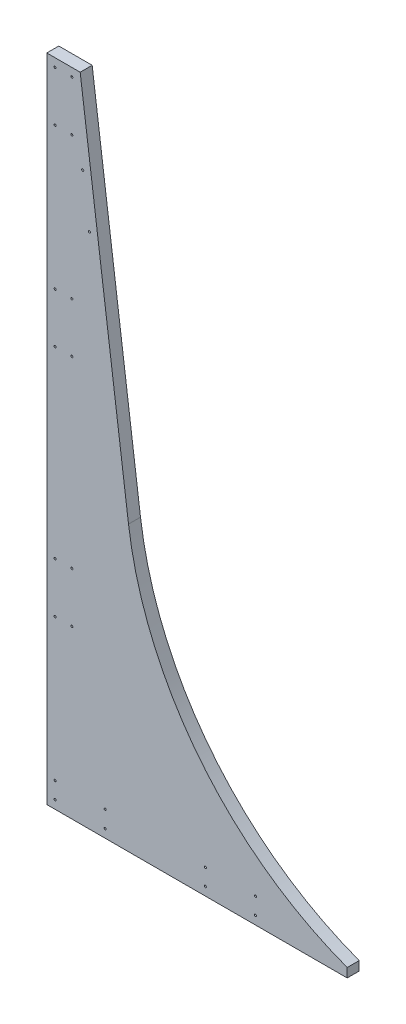
ISO-10303-21;
HEADER;
FILE_DESCRIPTION(('STEP AP214'),'2;1');
FILE_NAME('part.step','',(''),(''),'','','');
FILE_SCHEMA(('AUTOMOTIVE_DESIGN { 1 0 10303 214 1 1 1 1 }'));
ENDSEC;
DATA;
#1=APPLICATION_CONTEXT('core data for automotive mechanical design processes');
#2=APPLICATION_PROTOCOL_DEFINITION('international standard','automotive_design',2000,#1);
#3=PRODUCT_CONTEXT('',#1,'mechanical');
#4=PRODUCT('Part','Part','',(#3));
#5=PRODUCT_RELATED_PRODUCT_CATEGORY('part','',(#4));
#6=PRODUCT_DEFINITION_FORMATION('','',#4);
#7=PRODUCT_DEFINITION_CONTEXT('part definition',#1,'design');
#8=PRODUCT_DEFINITION('design','',#6,#7);
#9=PRODUCT_DEFINITION_SHAPE('','',#8);
#10=(LENGTH_UNIT() NAMED_UNIT(*) SI_UNIT(.MILLI.,.METRE.));
#11=(NAMED_UNIT(*) PLANE_ANGLE_UNIT() SI_UNIT($,.RADIAN.));
#12=(NAMED_UNIT(*) SI_UNIT($,.STERADIAN.) SOLID_ANGLE_UNIT());
#13=UNCERTAINTY_MEASURE_WITH_UNIT(LENGTH_MEASURE(1.E-05),#10,'distance_accuracy_value','');
#14=(GEOMETRIC_REPRESENTATION_CONTEXT(3) GLOBAL_UNCERTAINTY_ASSIGNED_CONTEXT((#13)) GLOBAL_UNIT_ASSIGNED_CONTEXT((#10,
#11,#12)) REPRESENTATION_CONTEXT('',''));
#15=CARTESIAN_POINT('',(0.,0.,0.));
#16=DIRECTION('',(0.,0.,1.));
#17=DIRECTION('',(1.,0.,0.));
#18=AXIS2_PLACEMENT_3D('',#15,#16,#17);
#19=CARTESIAN_POINT('',(638.116559349375,499.436357901165,18.25625));
#20=DIRECTION('',(0.,0.,-1.));
#21=DIRECTION('',(-1.,0.,0.));
#22=AXIS2_PLACEMENT_3D('',#19,#20,#21);
#23=CYLINDRICAL_SURFACE('',#22,518.182264806593);
#24=CARTESIAN_POINT('',(638.116559349375,499.436357901165,0.));
#25=DIRECTION('',(0.,0.,1.));
#26=DIRECTION('',(1.,0.,0.));
#27=AXIS2_PLACEMENT_3D('',#24,#25,#26);
#28=CIRCLE('',#27,518.182264806593);
#29=CARTESIAN_POINT('',(124.367415651835,431.8,0.));
#30=VERTEX_POINT('',#29);
#31=CARTESIAN_POINT('',(457.201,13.8620382080899,0.));
#32=VERTEX_POINT('',#31);
#33=EDGE_CURVE('E132',#30,#32,#28,.T.);
#34=ORIENTED_EDGE('',*,*,#33,.F.);
#35=DIRECTION('',(0.,0.,-1.));
#36=VECTOR('',#35,1.);
#37=CARTESIAN_POINT('',(124.367415651835,431.8,18.25625));
#38=LINE('',#37,#36);
#39=CARTESIAN_POINT('',(124.367415651835,431.8,18.25625));
#40=VERTEX_POINT('',#39);
#41=EDGE_CURVE('E11',#40,#30,#38,.T.);
#42=ORIENTED_EDGE('',*,*,#41,.F.);
#43=CARTESIAN_POINT('',(638.116559349375,499.436357901165,18.25625));
#44=DIRECTION('',(0.,0.,1.));
#45=DIRECTION('',(1.,0.,0.));
#46=AXIS2_PLACEMENT_3D('',#43,#44,#45);
#47=CIRCLE('',#46,518.182264806593);
#48=CARTESIAN_POINT('',(457.201,13.8620382080899,18.25625));
#49=VERTEX_POINT('',#48);
#50=EDGE_CURVE('E147',#40,#49,#47,.T.);
#51=ORIENTED_EDGE('',*,*,#50,.T.);
#52=DIRECTION('',(0.,0.,-1.));
#53=VECTOR('',#52,1.);
#54=CARTESIAN_POINT('',(457.201,13.8620382080899,18.25625));
#55=LINE('',#54,#53);
#56=EDGE_CURVE('E65',#49,#32,#55,.T.);
#57=ORIENTED_EDGE('',*,*,#56,.T.);
#58=EDGE_LOOP('',(#34,#42,#51,#57));
#59=FACE_BOUND('',#58,.T.);
#60=ADVANCED_FACE('F49',(#59),#23,.F.);
#61=CARTESIAN_POINT('',(178.127589027018,23.4509419846275,18.25625));
#62=DIRECTION('',(0.991444861373811,0.130526192220048,0.));
#63=DIRECTION('',(-0.130526192220048,0.991444861373811,0.));
#64=AXIS2_PLACEMENT_3D('',#61,#62,#63);
#65=PLANE('',#64);
#66=DIRECTION('',(0.130526192220048,-0.991444861373811,0.));
#67=VECTOR('',#66,1.);
#68=CARTESIAN_POINT('',(178.127589027018,23.4509419846275,0.));
#69=LINE('',#68,#67);
#70=CARTESIAN_POINT('',(50.8,990.6,0.));
#71=VERTEX_POINT('',#70);
#72=EDGE_CURVE('E134',#71,#30,#69,.T.);
#73=ORIENTED_EDGE('',*,*,#72,.F.);
#74=DIRECTION('',(0.,0.,-1.));
#75=VECTOR('',#74,1.);
#76=CARTESIAN_POINT('',(50.8,990.6,18.25625));
#77=LINE('',#76,#75);
#78=CARTESIAN_POINT('',(50.8,990.6,18.25625));
#79=VERTEX_POINT('',#78);
#80=EDGE_CURVE('E57',#79,#71,#77,.T.);
#81=ORIENTED_EDGE('',*,*,#80,.F.);
#82=DIRECTION('',(0.130526192220048,-0.991444861373811,0.));
#83=VECTOR('',#82,1.);
#84=CARTESIAN_POINT('',(178.127589027018,23.4509419846275,18.25625));
#85=LINE('',#84,#83);
#86=EDGE_CURVE('E127',#79,#40,#85,.T.);
#87=ORIENTED_EDGE('',*,*,#86,.T.);
#88=ORIENTED_EDGE('',*,*,#41,.T.);
#89=EDGE_LOOP('',(#73,#81,#87,#88));
#90=FACE_BOUND('',#89,.T.);
#91=ADVANCED_FACE('F156',(#90),#65,.T.);
#92=CARTESIAN_POINT('',(0.,990.6,18.25625));
#93=DIRECTION('',(0.,1.,0.));
#94=DIRECTION('',(0.,0.,1.));
#95=AXIS2_PLACEMENT_3D('',#92,#93,#94);
#96=PLANE('',#95);
#97=DIRECTION('',(1.,0.,0.));
#98=VECTOR('',#97,1.);
#99=CARTESIAN_POINT('',(0.,990.6,0.));
#100=LINE('',#99,#98);
#101=CARTESIAN_POINT('',(0.,990.6,0.));
#102=VERTEX_POINT('',#101);
#103=EDGE_CURVE('E138',#102,#71,#100,.T.);
#104=ORIENTED_EDGE('',*,*,#103,.F.);
#105=DIRECTION('',(0.,0.,-1.));
#106=VECTOR('',#105,1.);
#107=CARTESIAN_POINT('',(0.,990.6,18.25625));
#108=LINE('',#107,#106);
#109=CARTESIAN_POINT('',(0.,990.6,18.25625));
#110=VERTEX_POINT('',#109);
#111=EDGE_CURVE('E113',#110,#102,#108,.T.);
#112=ORIENTED_EDGE('',*,*,#111,.F.);
#113=DIRECTION('',(1.,0.,0.));
#114=VECTOR('',#113,1.);
#115=CARTESIAN_POINT('',(0.,990.6,18.25625));
#116=LINE('',#115,#114);
#117=EDGE_CURVE('E125',#110,#79,#116,.T.);
#118=ORIENTED_EDGE('',*,*,#117,.T.);
#119=ORIENTED_EDGE('',*,*,#80,.T.);
#120=EDGE_LOOP('',(#104,#112,#118,#119));
#121=FACE_BOUND('',#120,.T.);
#122=ADVANCED_FACE('F153',(#121),#96,.T.);
#123=CARTESIAN_POINT('',(0.,0.,18.25625));
#124=DIRECTION('',(-1.,0.,0.));
#125=DIRECTION('',(0.,0.,1.));
#126=AXIS2_PLACEMENT_3D('',#123,#124,#125);
#127=PLANE('',#126);
#128=DIRECTION('',(0.,1.,0.));
#129=VECTOR('',#128,1.);
#130=CARTESIAN_POINT('',(0.,0.,0.));
#131=LINE('',#130,#129);
#132=CARTESIAN_POINT('',(0.,0.,0.));
#133=VERTEX_POINT('',#132);
#134=EDGE_CURVE('E110',#133,#102,#131,.T.);
#135=ORIENTED_EDGE('',*,*,#134,.F.);
#136=DIRECTION('',(0.,0.,-1.));
#137=VECTOR('',#136,1.);
#138=CARTESIAN_POINT('',(0.,0.,18.25625));
#139=LINE('',#138,#137);
#140=CARTESIAN_POINT('',(0.,0.,18.25625));
#141=VERTEX_POINT('',#140);
#142=EDGE_CURVE('E104',#141,#133,#139,.T.);
#143=ORIENTED_EDGE('',*,*,#142,.F.);
#144=DIRECTION('',(0.,1.,0.));
#145=VECTOR('',#144,1.);
#146=CARTESIAN_POINT('',(0.,0.,18.25625));
#147=LINE('',#146,#145);
#148=EDGE_CURVE('E108',#141,#110,#147,.T.);
#149=ORIENTED_EDGE('',*,*,#148,.T.);
#150=ORIENTED_EDGE('',*,*,#111,.T.);
#151=EDGE_LOOP('',(#135,#143,#149,#150));
#152=FACE_BOUND('',#151,.T.);
#153=ADVANCED_FACE('F106',(#152),#127,.T.);
#154=CARTESIAN_POINT('',(0.,0.,18.25625));
#155=DIRECTION('',(0.,1.,0.));
#156=DIRECTION('',(0.,0.,1.));
#157=AXIS2_PLACEMENT_3D('',#154,#155,#156);
#158=PLANE('',#157);
#159=DIRECTION('',(1.,0.,0.));
#160=VECTOR('',#159,1.);
#161=CARTESIAN_POINT('',(0.,0.,0.));
#162=LINE('',#161,#160);
#163=CARTESIAN_POINT('',(457.201,0.,0.));
#164=VERTEX_POINT('',#163);
#165=EDGE_CURVE('E142',#133,#164,#162,.T.);
#166=ORIENTED_EDGE('',*,*,#165,.T.);
#167=DIRECTION('',(0.,0.,-1.));
#168=VECTOR('',#167,1.);
#169=CARTESIAN_POINT('',(457.201,0.,18.25625));
#170=LINE('',#169,#168);
#171=CARTESIAN_POINT('',(457.201,0.,18.25625));
#172=VERTEX_POINT('',#171);
#173=EDGE_CURVE('E85',#172,#164,#170,.T.);
#174=ORIENTED_EDGE('',*,*,#173,.F.);
#175=DIRECTION('',(1.,0.,0.));
#176=VECTOR('',#175,1.);
#177=CARTESIAN_POINT('',(0.,0.,18.25625));
#178=LINE('',#177,#176);
#179=EDGE_CURVE('E115',#141,#172,#178,.T.);
#180=ORIENTED_EDGE('',*,*,#179,.F.);
#181=ORIENTED_EDGE('',*,*,#142,.T.);
#182=EDGE_LOOP('',(#166,#174,#180,#181));
#183=FACE_BOUND('',#182,.T.);
#184=ADVANCED_FACE('F116',(#183),#158,.F.);
#185=CARTESIAN_POINT('',(457.201,0.,18.25625));
#186=DIRECTION('',(1.,0.,0.));
#187=DIRECTION('',(0.,0.,-1.));
#188=AXIS2_PLACEMENT_3D('',#185,#186,#187);
#189=PLANE('',#188);
#190=DIRECTION('',(0.,-1.,0.));
#191=VECTOR('',#190,1.);
#192=CARTESIAN_POINT('',(457.201,0.,0.));
#193=LINE('',#192,#191);
#194=EDGE_CURVE('E144',#32,#164,#193,.T.);
#195=ORIENTED_EDGE('',*,*,#194,.F.);
#196=ORIENTED_EDGE('',*,*,#56,.F.);
#197=DIRECTION('',(0.,-1.,0.));
#198=VECTOR('',#197,1.);
#199=CARTESIAN_POINT('',(457.201,0.,18.25625));
#200=LINE('',#199,#198);
#201=EDGE_CURVE('E119',#49,#172,#200,.T.);
#202=ORIENTED_EDGE('',*,*,#201,.T.);
#203=ORIENTED_EDGE('',*,*,#173,.T.);
#204=EDGE_LOOP('',(#195,#196,#202,#203));
#205=FACE_BOUND('',#204,.T.);
#206=ADVANCED_FACE('F159',(#205),#189,.T.);
#207=CARTESIAN_POINT('',(0.,0.,18.25625));
#208=DIRECTION('',(0.,0.,1.));
#209=DIRECTION('',(1.,0.,0.));
#210=AXIS2_PLACEMENT_3D('',#207,#208,#209);
#211=PLANE('',#210);
#212=CARTESIAN_POINT('',(64.7421997103902,787.4,18.25625));
#213=DIRECTION('',(0.,0.,1.));
#214=DIRECTION('',(1.,0.,0.));
#215=AXIS2_PLACEMENT_3D('',#212,#213,#214);
#216=CIRCLE('',#215,1.58750000000007);
#217=CARTESIAN_POINT('',(66.3296997103903,787.4,18.25625));
#218=VERTEX_POINT('',#217);
#219=EDGE_CURVE('E436',#218,#218,#216,.T.);
#220=ORIENTED_EDGE('',*,*,#219,.F.);
#221=EDGE_LOOP('',(#220));
#222=FACE_BOUND('',#221,.T.);
#223=CARTESIAN_POINT('',(54.7102793942309,863.6,18.25625));
#224=DIRECTION('',(0.,0.,1.));
#225=DIRECTION('',(1.,0.,0.));
#226=AXIS2_PLACEMENT_3D('',#223,#224,#225);
#227=CIRCLE('',#226,1.58750000000009);
#228=CARTESIAN_POINT('',(56.297779394231,863.6,18.25625));
#229=VERTEX_POINT('',#228);
#230=EDGE_CURVE('E442',#229,#229,#227,.T.);
#231=ORIENTED_EDGE('',*,*,#230,.F.);
#232=EDGE_LOOP('',(#231));
#233=FACE_BOUND('',#232,.T.);
#234=CARTESIAN_POINT('',(12.7000000000001,38.0999999999999,18.25625));
#235=DIRECTION('',(0.,0.,1.));
#236=DIRECTION('',(1.,0.,0.));
#237=AXIS2_PLACEMENT_3D('',#234,#235,#236);
#238=CIRCLE('',#237,1.5875);
#239=CARTESIAN_POINT('',(14.2875000000001,38.0999999999999,18.25625));
#240=VERTEX_POINT('',#239);
#241=EDGE_CURVE('E480',#240,#240,#238,.T.);
#242=ORIENTED_EDGE('',*,*,#241,.F.);
#243=EDGE_LOOP('',(#242));
#244=FACE_BOUND('',#243,.T.);
#245=CARTESIAN_POINT('',(38.1000000000001,330.2,18.25625));
#246=DIRECTION('',(0.,0.,1.));
#247=DIRECTION('',(1.,0.,0.));
#248=AXIS2_PLACEMENT_3D('',#245,#246,#247);
#249=CIRCLE('',#248,1.58750000000001);
#250=CARTESIAN_POINT('',(39.6875000000001,330.2,18.25625));
#251=VERTEX_POINT('',#250);
#252=EDGE_CURVE('E493',#251,#251,#249,.T.);
#253=ORIENTED_EDGE('',*,*,#252,.F.);
#254=EDGE_LOOP('',(#253));
#255=FACE_BOUND('',#254,.T.);
#256=CARTESIAN_POINT('',(12.7000000000001,330.2,18.25625));
#257=DIRECTION('',(0.,0.,1.));
#258=DIRECTION('',(1.,0.,0.));
#259=AXIS2_PLACEMENT_3D('',#256,#257,#258);
#260=CIRCLE('',#259,1.5875);
#261=CARTESIAN_POINT('',(14.2875000000001,330.2,18.25625));
#262=VERTEX_POINT('',#261);
#263=EDGE_CURVE('E492',#262,#262,#260,.T.);
#264=ORIENTED_EDGE('',*,*,#263,.F.);
#265=EDGE_LOOP('',(#264));
#266=FACE_BOUND('',#265,.T.);
#267=CARTESIAN_POINT('',(38.1000000000001,254.,18.25625));
#268=DIRECTION('',(0.,0.,1.));
#269=DIRECTION('',(1.,0.,0.));
#270=AXIS2_PLACEMENT_3D('',#267,#268,#269);
#271=CIRCLE('',#270,1.58750000000006);
#272=CARTESIAN_POINT('',(39.6875000000001,254.,18.25625));
#273=VERTEX_POINT('',#272);
#274=EDGE_CURVE('E505',#273,#273,#271,.T.);
#275=ORIENTED_EDGE('',*,*,#274,.F.);
#276=EDGE_LOOP('',(#275));
#277=FACE_BOUND('',#276,.T.);
#278=CARTESIAN_POINT('',(241.3,38.0999999999999,18.25625));
#279=DIRECTION('',(0.,0.,1.));
#280=DIRECTION('',(1.,0.,0.));
#281=AXIS2_PLACEMENT_3D('',#278,#279,#280);
#282=CIRCLE('',#281,1.58749999999999);
#283=CARTESIAN_POINT('',(242.8875,38.0999999999999,18.25625));
#284=VERTEX_POINT('',#283);
#285=EDGE_CURVE('E456',#284,#284,#282,.T.);
#286=ORIENTED_EDGE('',*,*,#285,.F.);
#287=EDGE_LOOP('',(#286));
#288=FACE_BOUND('',#287,.T.);
#289=CARTESIAN_POINT('',(88.9000000000001,12.6999999999999,18.25625));
#290=DIRECTION('',(0.,0.,1.));
#291=DIRECTION('',(1.,0.,0.));
#292=AXIS2_PLACEMENT_3D('',#289,#290,#291);
#293=CIRCLE('',#292,1.58749999999998);
#294=CARTESIAN_POINT('',(90.4875000000001,12.6999999999999,18.25625));
#295=VERTEX_POINT('',#294);
#296=EDGE_CURVE('E469',#295,#295,#293,.T.);
#297=ORIENTED_EDGE('',*,*,#296,.F.);
#298=EDGE_LOOP('',(#297));
#299=FACE_BOUND('',#298,.T.);
#300=CARTESIAN_POINT('',(88.9000000000001,38.0999999999999,18.25625));
#301=DIRECTION('',(0.,0.,1.));
#302=DIRECTION('',(1.,0.,0.));
#303=AXIS2_PLACEMENT_3D('',#300,#301,#302);
#304=CIRCLE('',#303,1.58749999999999);
#305=CARTESIAN_POINT('',(90.4875000000001,38.0999999999999,18.25625));
#306=VERTEX_POINT('',#305);
#307=EDGE_CURVE('E468',#306,#306,#304,.T.);
#308=ORIENTED_EDGE('',*,*,#307,.F.);
#309=EDGE_LOOP('',(#308));
#310=FACE_BOUND('',#309,.T.);
#311=CARTESIAN_POINT('',(12.7000000000001,12.6999999999999,18.25625));
#312=DIRECTION('',(0.,0.,1.));
#313=DIRECTION('',(1.,0.,0.));
#314=AXIS2_PLACEMENT_3D('',#311,#312,#313);
#315=CIRCLE('',#314,1.5875);
#316=CARTESIAN_POINT('',(14.2875000000001,12.6999999999999,18.25625));
#317=VERTEX_POINT('',#316);
#318=EDGE_CURVE('E481',#317,#317,#315,.T.);
#319=ORIENTED_EDGE('',*,*,#318,.F.);
#320=EDGE_LOOP('',(#319));
#321=FACE_BOUND('',#320,.T.);
#322=CARTESIAN_POINT('',(12.7,609.6,18.25625));
#323=DIRECTION('',(0.,0.,1.));
#324=DIRECTION('',(1.,0.,0.));
#325=AXIS2_PLACEMENT_3D('',#322,#323,#324);
#326=CIRCLE('',#325,1.58750000000007);
#327=CARTESIAN_POINT('',(14.2875000000001,609.6,18.25625));
#328=VERTEX_POINT('',#327);
#329=EDGE_CURVE('E528',#328,#328,#326,.T.);
#330=ORIENTED_EDGE('',*,*,#329,.F.);
#331=EDGE_LOOP('',(#330));
#332=FACE_BOUND('',#331,.T.);
#333=CARTESIAN_POINT('',(38.1,901.7,18.25625));
#334=DIRECTION('',(0.,0.,1.));
#335=DIRECTION('',(1.,0.,0.));
#336=AXIS2_PLACEMENT_3D('',#333,#334,#335);
#337=CIRCLE('',#336,1.58750000000008);
#338=CARTESIAN_POINT('',(39.6875000000001,901.7,18.25625));
#339=VERTEX_POINT('',#338);
#340=EDGE_CURVE('E541',#339,#339,#337,.T.);
#341=ORIENTED_EDGE('',*,*,#340,.F.);
#342=EDGE_LOOP('',(#341));
#343=FACE_BOUND('',#342,.T.);
#344=CARTESIAN_POINT('',(12.7,901.7,18.25625));
#345=DIRECTION('',(0.,0.,1.));
#346=DIRECTION('',(1.,0.,0.));
#347=AXIS2_PLACEMENT_3D('',#344,#345,#346);
#348=CIRCLE('',#347,1.58750000000007);
#349=CARTESIAN_POINT('',(14.2875000000001,901.7,18.25625));
#350=VERTEX_POINT('',#349);
#351=EDGE_CURVE('E540',#350,#350,#348,.T.);
#352=ORIENTED_EDGE('',*,*,#351,.F.);
#353=EDGE_LOOP('',(#352));
#354=FACE_BOUND('',#353,.T.);
#355=CARTESIAN_POINT('',(38.1,977.9,18.25625));
#356=DIRECTION('',(0.,0.,1.));
#357=DIRECTION('',(1.,0.,0.));
#358=AXIS2_PLACEMENT_3D('',#355,#356,#357);
#359=CIRCLE('',#358,1.58750000000007);
#360=CARTESIAN_POINT('',(39.6875000000001,977.9,18.25625));
#361=VERTEX_POINT('',#360);
#362=EDGE_CURVE('E553',#361,#361,#359,.T.);
#363=ORIENTED_EDGE('',*,*,#362,.F.);
#364=EDGE_LOOP('',(#363));
#365=FACE_BOUND('',#364,.T.);
#366=CARTESIAN_POINT('',(12.7000000000001,254.,18.25625));
#367=DIRECTION('',(0.,0.,1.));
#368=DIRECTION('',(1.,0.,0.));
#369=AXIS2_PLACEMENT_3D('',#366,#367,#368);
#370=CIRCLE('',#369,1.58750000000002);
#371=CARTESIAN_POINT('',(14.2875000000001,254.,18.25625));
#372=VERTEX_POINT('',#371);
#373=EDGE_CURVE('E504',#372,#372,#370,.T.);
#374=ORIENTED_EDGE('',*,*,#373,.F.);
#375=EDGE_LOOP('',(#374));
#376=FACE_BOUND('',#375,.T.);
#377=CARTESIAN_POINT('',(38.1,685.8,18.25625));
#378=DIRECTION('',(0.,0.,1.));
#379=DIRECTION('',(1.,0.,0.));
#380=AXIS2_PLACEMENT_3D('',#377,#378,#379);
#381=CIRCLE('',#380,1.58750000000007);
#382=CARTESIAN_POINT('',(39.6875000000001,685.8,18.25625));
#383=VERTEX_POINT('',#382);
#384=EDGE_CURVE('E517',#383,#383,#381,.T.);
#385=ORIENTED_EDGE('',*,*,#384,.F.);
#386=EDGE_LOOP('',(#385));
#387=FACE_BOUND('',#386,.T.);
#388=CARTESIAN_POINT('',(12.7,685.8,18.25625));
#389=DIRECTION('',(0.,0.,1.));
#390=DIRECTION('',(1.,0.,0.));
#391=AXIS2_PLACEMENT_3D('',#388,#389,#390);
#392=CIRCLE('',#391,1.58750000000004);
#393=CARTESIAN_POINT('',(14.2875000000001,685.8,18.25625));
#394=VERTEX_POINT('',#393);
#395=EDGE_CURVE('E516',#394,#394,#392,.T.);
#396=ORIENTED_EDGE('',*,*,#395,.F.);
#397=EDGE_LOOP('',(#396));
#398=FACE_BOUND('',#397,.T.);
#399=CARTESIAN_POINT('',(38.1000000000001,609.6,18.25625));
#400=DIRECTION('',(0.,0.,1.));
#401=DIRECTION('',(1.,0.,0.));
#402=AXIS2_PLACEMENT_3D('',#399,#400,#401);
#403=CIRCLE('',#402,1.58750000000007);
#404=CARTESIAN_POINT('',(39.6875000000001,609.6,18.25625));
#405=VERTEX_POINT('',#404);
#406=EDGE_CURVE('E529',#405,#405,#403,.T.);
#407=ORIENTED_EDGE('',*,*,#406,.F.);
#408=EDGE_LOOP('',(#407));
#409=FACE_BOUND('',#408,.T.);
#410=CARTESIAN_POINT('',(317.5,12.6999999999999,18.25625));
#411=DIRECTION('',(0.,0.,1.));
#412=DIRECTION('',(1.,0.,0.));
#413=AXIS2_PLACEMENT_3D('',#410,#411,#412);
#414=CIRCLE('',#413,1.58750000000004);
#415=CARTESIAN_POINT('',(319.0875,12.6999999999999,18.25625));
#416=VERTEX_POINT('',#415);
#417=EDGE_CURVE('E439',#416,#416,#414,.T.);
#418=ORIENTED_EDGE('',*,*,#417,.F.);
#419=EDGE_LOOP('',(#418));
#420=FACE_BOUND('',#419,.T.);
#421=CARTESIAN_POINT('',(241.3,12.6999999999999,18.25625));
#422=DIRECTION('',(0.,0.,1.));
#423=DIRECTION('',(1.,0.,0.));
#424=AXIS2_PLACEMENT_3D('',#421,#422,#423);
#425=CIRCLE('',#424,1.58749999999999);
#426=CARTESIAN_POINT('',(242.8875,12.6999999999999,18.25625));
#427=VERTEX_POINT('',#426);
#428=EDGE_CURVE('E450',#427,#427,#425,.T.);
#429=ORIENTED_EDGE('',*,*,#428,.F.);
#430=EDGE_LOOP('',(#429));
#431=FACE_BOUND('',#430,.T.);
#432=CARTESIAN_POINT('',(317.5,38.0999999999999,18.25625));
#433=DIRECTION('',(0.,0.,1.));
#434=DIRECTION('',(1.,0.,0.));
#435=AXIS2_PLACEMENT_3D('',#432,#433,#434);
#436=CIRCLE('',#435,1.58750000000004);
#437=CARTESIAN_POINT('',(319.0875,38.0999999999999,18.25625));
#438=VERTEX_POINT('',#437);
#439=EDGE_CURVE('E457',#438,#438,#436,.T.);
#440=ORIENTED_EDGE('',*,*,#439,.F.);
#441=EDGE_LOOP('',(#440));
#442=FACE_BOUND('',#441,.T.);
#443=CARTESIAN_POINT('',(12.7,977.9,18.25625));
#444=DIRECTION('',(0.,0.,1.));
#445=DIRECTION('',(1.,0.,0.));
#446=AXIS2_PLACEMENT_3D('',#443,#444,#445);
#447=CIRCLE('',#446,1.58750000000004);
#448=CARTESIAN_POINT('',(14.2875,977.9,18.25625));
#449=VERTEX_POINT('',#448);
#450=EDGE_CURVE('E552',#449,#449,#447,.T.);
#451=ORIENTED_EDGE('',*,*,#450,.F.);
#452=EDGE_LOOP('',(#451));
#453=FACE_BOUND('',#452,.T.);
#454=ORIENTED_EDGE('',*,*,#50,.F.);
#455=ORIENTED_EDGE('',*,*,#86,.F.);
#456=ORIENTED_EDGE('',*,*,#117,.F.);
#457=ORIENTED_EDGE('',*,*,#148,.F.);
#458=ORIENTED_EDGE('',*,*,#179,.T.);
#459=ORIENTED_EDGE('',*,*,#201,.F.);
#460=EDGE_LOOP('',(#454,#455,#456,#457,#458,#459));
#461=FACE_BOUND('',#460,.T.);
#462=ADVANCED_FACE('F122',(#222,#233,#244,#255,#266,#277,#288,#299,#310,#321,#332,#343,#354,
#365,#376,#387,#398,#409,#420,#431,#442,#453,#461),#211,.T.);
#463=CARTESIAN_POINT('',(0.,0.,0.));
#464=DIRECTION('',(0.,0.,1.));
#465=DIRECTION('',(1.,0.,0.));
#466=AXIS2_PLACEMENT_3D('',#463,#464,#465);
#467=PLANE('',#466);
#468=CARTESIAN_POINT('',(64.7421997103902,787.4,0.));
#469=DIRECTION('',(0.,0.,1.));
#470=DIRECTION('',(1.,0.,0.));
#471=AXIS2_PLACEMENT_3D('',#468,#469,#470);
#472=CIRCLE('',#471,1.58750000000007);
#473=CARTESIAN_POINT('',(66.3296997103903,787.4,0.));
#474=VERTEX_POINT('',#473);
#475=EDGE_CURVE('E433',#474,#474,#472,.T.);
#476=ORIENTED_EDGE('',*,*,#475,.T.);
#477=EDGE_LOOP('',(#476));
#478=FACE_BOUND('',#477,.T.);
#479=CARTESIAN_POINT('',(54.7102793942309,863.6,0.));
#480=DIRECTION('',(0.,0.,1.));
#481=DIRECTION('',(1.,0.,0.));
#482=AXIS2_PLACEMENT_3D('',#479,#480,#481);
#483=CIRCLE('',#482,1.58750000000009);
#484=CARTESIAN_POINT('',(56.297779394231,863.6,0.));
#485=VERTEX_POINT('',#484);
#486=EDGE_CURVE('E437',#485,#485,#483,.T.);
#487=ORIENTED_EDGE('',*,*,#486,.T.);
#488=EDGE_LOOP('',(#487));
#489=FACE_BOUND('',#488,.T.);
#490=CARTESIAN_POINT('',(12.7000000000001,38.0999999999999,0.));
#491=DIRECTION('',(0.,0.,1.));
#492=DIRECTION('',(1.,0.,0.));
#493=AXIS2_PLACEMENT_3D('',#490,#491,#492);
#494=CIRCLE('',#493,1.5875);
#495=CARTESIAN_POINT('',(14.2875000000001,38.0999999999999,0.));
#496=VERTEX_POINT('',#495);
#497=EDGE_CURVE('E496',#496,#496,#494,.T.);
#498=ORIENTED_EDGE('',*,*,#497,.T.);
#499=EDGE_LOOP('',(#498));
#500=FACE_BOUND('',#499,.T.);
#501=CARTESIAN_POINT('',(38.1000000000001,330.2,0.));
#502=DIRECTION('',(0.,0.,1.));
#503=DIRECTION('',(1.,0.,0.));
#504=AXIS2_PLACEMENT_3D('',#501,#502,#503);
#505=CIRCLE('',#504,1.58750000000001);
#506=CARTESIAN_POINT('',(39.6875000000001,330.2,0.));
#507=VERTEX_POINT('',#506);
#508=EDGE_CURVE('E489',#507,#507,#505,.T.);
#509=ORIENTED_EDGE('',*,*,#508,.T.);
#510=EDGE_LOOP('',(#509));
#511=FACE_BOUND('',#510,.T.);
#512=CARTESIAN_POINT('',(12.7000000000001,330.2,0.));
#513=DIRECTION('',(0.,0.,1.));
#514=DIRECTION('',(1.,0.,0.));
#515=AXIS2_PLACEMENT_3D('',#512,#513,#514);
#516=CIRCLE('',#515,1.5875);
#517=CARTESIAN_POINT('',(14.2875000000001,330.2,0.));
#518=VERTEX_POINT('',#517);
#519=EDGE_CURVE('E508',#518,#518,#516,.T.);
#520=ORIENTED_EDGE('',*,*,#519,.T.);
#521=EDGE_LOOP('',(#520));
#522=FACE_BOUND('',#521,.T.);
#523=CARTESIAN_POINT('',(38.1000000000001,254.,0.));
#524=DIRECTION('',(0.,0.,1.));
#525=DIRECTION('',(1.,0.,0.));
#526=AXIS2_PLACEMENT_3D('',#523,#524,#525);
#527=CIRCLE('',#526,1.58750000000006);
#528=CARTESIAN_POINT('',(39.6875000000001,254.,0.));
#529=VERTEX_POINT('',#528);
#530=EDGE_CURVE('E501',#529,#529,#527,.T.);
#531=ORIENTED_EDGE('',*,*,#530,.T.);
#532=EDGE_LOOP('',(#531));
#533=FACE_BOUND('',#532,.T.);
#534=CARTESIAN_POINT('',(241.3,38.0999999999999,0.));
#535=DIRECTION('',(0.,0.,1.));
#536=DIRECTION('',(1.,0.,0.));
#537=AXIS2_PLACEMENT_3D('',#534,#535,#536);
#538=CIRCLE('',#537,1.58749999999999);
#539=CARTESIAN_POINT('',(242.8875,38.0999999999999,0.));
#540=VERTEX_POINT('',#539);
#541=EDGE_CURVE('E472',#540,#540,#538,.T.);
#542=ORIENTED_EDGE('',*,*,#541,.T.);
#543=EDGE_LOOP('',(#542));
#544=FACE_BOUND('',#543,.T.);
#545=CARTESIAN_POINT('',(88.9000000000001,12.6999999999999,0.));
#546=DIRECTION('',(0.,0.,1.));
#547=DIRECTION('',(1.,0.,0.));
#548=AXIS2_PLACEMENT_3D('',#545,#546,#547);
#549=CIRCLE('',#548,1.58749999999998);
#550=CARTESIAN_POINT('',(90.4875000000001,12.6999999999999,0.));
#551=VERTEX_POINT('',#550);
#552=EDGE_CURVE('E465',#551,#551,#549,.T.);
#553=ORIENTED_EDGE('',*,*,#552,.T.);
#554=EDGE_LOOP('',(#553));
#555=FACE_BOUND('',#554,.T.);
#556=CARTESIAN_POINT('',(88.9000000000001,38.0999999999999,0.));
#557=DIRECTION('',(0.,0.,1.));
#558=DIRECTION('',(1.,0.,0.));
#559=AXIS2_PLACEMENT_3D('',#556,#557,#558);
#560=CIRCLE('',#559,1.58749999999999);
#561=CARTESIAN_POINT('',(90.4875000000001,38.0999999999999,0.));
#562=VERTEX_POINT('',#561);
#563=EDGE_CURVE('E484',#562,#562,#560,.T.);
#564=ORIENTED_EDGE('',*,*,#563,.T.);
#565=EDGE_LOOP('',(#564));
#566=FACE_BOUND('',#565,.T.);
#567=CARTESIAN_POINT('',(12.7000000000001,12.6999999999999,0.));
#568=DIRECTION('',(0.,0.,1.));
#569=DIRECTION('',(1.,0.,0.));
#570=AXIS2_PLACEMENT_3D('',#567,#568,#569);
#571=CIRCLE('',#570,1.5875);
#572=CARTESIAN_POINT('',(14.2875000000001,12.6999999999999,0.));
#573=VERTEX_POINT('',#572);
#574=EDGE_CURVE('E477',#573,#573,#571,.T.);
#575=ORIENTED_EDGE('',*,*,#574,.T.);
#576=EDGE_LOOP('',(#575));
#577=FACE_BOUND('',#576,.T.);
#578=CARTESIAN_POINT('',(12.7,609.6,0.));
#579=DIRECTION('',(0.,0.,1.));
#580=DIRECTION('',(1.,0.,0.));
#581=AXIS2_PLACEMENT_3D('',#578,#579,#580);
#582=CIRCLE('',#581,1.58750000000007);
#583=CARTESIAN_POINT('',(14.2875000000001,609.6,0.));
#584=VERTEX_POINT('',#583);
#585=EDGE_CURVE('E544',#584,#584,#582,.T.);
#586=ORIENTED_EDGE('',*,*,#585,.T.);
#587=EDGE_LOOP('',(#586));
#588=FACE_BOUND('',#587,.T.);
#589=CARTESIAN_POINT('',(38.1,901.7,0.));
#590=DIRECTION('',(0.,0.,1.));
#591=DIRECTION('',(1.,0.,0.));
#592=AXIS2_PLACEMENT_3D('',#589,#590,#591);
#593=CIRCLE('',#592,1.58750000000008);
#594=CARTESIAN_POINT('',(39.6875000000001,901.7,0.));
#595=VERTEX_POINT('',#594);
#596=EDGE_CURVE('E537',#595,#595,#593,.T.);
#597=ORIENTED_EDGE('',*,*,#596,.T.);
#598=EDGE_LOOP('',(#597));
#599=FACE_BOUND('',#598,.T.);
#600=CARTESIAN_POINT('',(12.7,901.7,0.));
#601=DIRECTION('',(0.,0.,1.));
#602=DIRECTION('',(1.,0.,0.));
#603=AXIS2_PLACEMENT_3D('',#600,#601,#602);
#604=CIRCLE('',#603,1.58750000000007);
#605=CARTESIAN_POINT('',(14.2875000000001,901.7,0.));
#606=VERTEX_POINT('',#605);
#607=EDGE_CURVE('E556',#606,#606,#604,.T.);
#608=ORIENTED_EDGE('',*,*,#607,.T.);
#609=EDGE_LOOP('',(#608));
#610=FACE_BOUND('',#609,.T.);
#611=CARTESIAN_POINT('',(38.1,977.9,0.));
#612=DIRECTION('',(0.,0.,1.));
#613=DIRECTION('',(1.,0.,0.));
#614=AXIS2_PLACEMENT_3D('',#611,#612,#613);
#615=CIRCLE('',#614,1.58750000000007);
#616=CARTESIAN_POINT('',(39.6875000000001,977.9,0.));
#617=VERTEX_POINT('',#616);
#618=EDGE_CURVE('E549',#617,#617,#615,.T.);
#619=ORIENTED_EDGE('',*,*,#618,.T.);
#620=EDGE_LOOP('',(#619));
#621=FACE_BOUND('',#620,.T.);
#622=CARTESIAN_POINT('',(12.7000000000001,254.,0.));
#623=DIRECTION('',(0.,0.,1.));
#624=DIRECTION('',(1.,0.,0.));
#625=AXIS2_PLACEMENT_3D('',#622,#623,#624);
#626=CIRCLE('',#625,1.58750000000002);
#627=CARTESIAN_POINT('',(14.2875000000001,254.,0.));
#628=VERTEX_POINT('',#627);
#629=EDGE_CURVE('E520',#628,#628,#626,.T.);
#630=ORIENTED_EDGE('',*,*,#629,.T.);
#631=EDGE_LOOP('',(#630));
#632=FACE_BOUND('',#631,.T.);
#633=CARTESIAN_POINT('',(38.1,685.8,0.));
#634=DIRECTION('',(0.,0.,1.));
#635=DIRECTION('',(1.,0.,0.));
#636=AXIS2_PLACEMENT_3D('',#633,#634,#635);
#637=CIRCLE('',#636,1.58750000000007);
#638=CARTESIAN_POINT('',(39.6875000000001,685.8,0.));
#639=VERTEX_POINT('',#638);
#640=EDGE_CURVE('E513',#639,#639,#637,.T.);
#641=ORIENTED_EDGE('',*,*,#640,.T.);
#642=EDGE_LOOP('',(#641));
#643=FACE_BOUND('',#642,.T.);
#644=CARTESIAN_POINT('',(12.7,685.8,0.));
#645=DIRECTION('',(0.,0.,1.));
#646=DIRECTION('',(1.,0.,0.));
#647=AXIS2_PLACEMENT_3D('',#644,#645,#646);
#648=CIRCLE('',#647,1.58750000000004);
#649=CARTESIAN_POINT('',(14.2875000000001,685.8,0.));
#650=VERTEX_POINT('',#649);
#651=EDGE_CURVE('E532',#650,#650,#648,.T.);
#652=ORIENTED_EDGE('',*,*,#651,.T.);
#653=EDGE_LOOP('',(#652));
#654=FACE_BOUND('',#653,.T.);
#655=CARTESIAN_POINT('',(38.1000000000001,609.6,0.));
#656=DIRECTION('',(0.,0.,1.));
#657=DIRECTION('',(1.,0.,0.));
#658=AXIS2_PLACEMENT_3D('',#655,#656,#657);
#659=CIRCLE('',#658,1.58750000000007);
#660=CARTESIAN_POINT('',(39.6875000000001,609.6,0.));
#661=VERTEX_POINT('',#660);
#662=EDGE_CURVE('E525',#661,#661,#659,.T.);
#663=ORIENTED_EDGE('',*,*,#662,.T.);
#664=EDGE_LOOP('',(#663));
#665=FACE_BOUND('',#664,.T.);
#666=CARTESIAN_POINT('',(317.5,12.6999999999999,0.));
#667=DIRECTION('',(0.,0.,1.));
#668=DIRECTION('',(1.,0.,0.));
#669=AXIS2_PLACEMENT_3D('',#666,#667,#668);
#670=CIRCLE('',#669,1.58750000000004);
#671=CARTESIAN_POINT('',(319.0875,12.6999999999999,0.));
#672=VERTEX_POINT('',#671);
#673=EDGE_CURVE('E447',#672,#672,#670,.T.);
#674=ORIENTED_EDGE('',*,*,#673,.T.);
#675=EDGE_LOOP('',(#674));
#676=FACE_BOUND('',#675,.T.);
#677=CARTESIAN_POINT('',(241.3,12.6999999999999,0.));
#678=DIRECTION('',(0.,0.,1.));
#679=DIRECTION('',(1.,0.,0.));
#680=AXIS2_PLACEMENT_3D('',#677,#678,#679);
#681=CIRCLE('',#680,1.58749999999999);
#682=CARTESIAN_POINT('',(242.8875,12.6999999999999,0.));
#683=VERTEX_POINT('',#682);
#684=EDGE_CURVE('E460',#683,#683,#681,.T.);
#685=ORIENTED_EDGE('',*,*,#684,.T.);
#686=EDGE_LOOP('',(#685));
#687=FACE_BOUND('',#686,.T.);
#688=CARTESIAN_POINT('',(317.5,38.0999999999999,0.));
#689=DIRECTION('',(0.,0.,1.));
#690=DIRECTION('',(1.,0.,0.));
#691=AXIS2_PLACEMENT_3D('',#688,#689,#690);
#692=CIRCLE('',#691,1.58750000000004);
#693=CARTESIAN_POINT('',(319.0875,38.0999999999999,0.));
#694=VERTEX_POINT('',#693);
#695=EDGE_CURVE('E453',#694,#694,#692,.T.);
#696=ORIENTED_EDGE('',*,*,#695,.T.);
#697=EDGE_LOOP('',(#696));
#698=FACE_BOUND('',#697,.T.);
#699=CARTESIAN_POINT('',(12.7,977.9,0.));
#700=DIRECTION('',(0.,0.,1.));
#701=DIRECTION('',(1.,0.,0.));
#702=AXIS2_PLACEMENT_3D('',#699,#700,#701);
#703=CIRCLE('',#702,1.58750000000004);
#704=CARTESIAN_POINT('',(14.2875,977.9,0.));
#705=VERTEX_POINT('',#704);
#706=EDGE_CURVE('E135',#705,#705,#703,.T.);
#707=ORIENTED_EDGE('',*,*,#706,.T.);
#708=EDGE_LOOP('',(#707));
#709=FACE_BOUND('',#708,.T.);
#710=ORIENTED_EDGE('',*,*,#33,.T.);
#711=ORIENTED_EDGE('',*,*,#194,.T.);
#712=ORIENTED_EDGE('',*,*,#165,.F.);
#713=ORIENTED_EDGE('',*,*,#134,.T.);
#714=ORIENTED_EDGE('',*,*,#103,.T.);
#715=ORIENTED_EDGE('',*,*,#72,.T.);
#716=EDGE_LOOP('',(#710,#711,#712,#713,#714,#715));
#717=FACE_BOUND('',#716,.T.);
#718=ADVANCED_FACE('F158',(#478,#489,#500,#511,#522,#533,#544,#555,#566,#577,#588,#599,#610,
#621,#632,#643,#654,#665,#676,#687,#698,#709,#717),#467,.F.);
#719=CARTESIAN_POINT('',(12.7,977.9,0.));
#720=DIRECTION('',(0.,0.,1.));
#721=DIRECTION('',(1.,0.,0.));
#722=AXIS2_PLACEMENT_3D('',#719,#720,#721);
#723=CYLINDRICAL_SURFACE('',#722,1.58750000000004);
#724=ORIENTED_EDGE('',*,*,#706,.F.);
#725=EDGE_LOOP('',(#724));
#726=FACE_BOUND('',#725,.T.);
#727=ORIENTED_EDGE('',*,*,#450,.T.);
#728=EDGE_LOOP('',(#727));
#729=FACE_BOUND('',#728,.T.);
#730=ADVANCED_FACE('F198',(#726,#729),#723,.F.);
#731=CARTESIAN_POINT('',(317.5,38.0999999999999,0.));
#732=DIRECTION('',(0.,0.,1.));
#733=DIRECTION('',(1.,0.,0.));
#734=AXIS2_PLACEMENT_3D('',#731,#732,#733);
#735=CYLINDRICAL_SURFACE('',#734,1.58750000000004);
#736=ORIENTED_EDGE('',*,*,#695,.F.);
#737=EDGE_LOOP('',(#736));
#738=FACE_BOUND('',#737,.T.);
#739=ORIENTED_EDGE('',*,*,#439,.T.);
#740=EDGE_LOOP('',(#739));
#741=FACE_BOUND('',#740,.T.);
#742=ADVANCED_FACE('F203',(#738,#741),#735,.F.);
#743=CARTESIAN_POINT('',(241.3,12.6999999999999,0.));
#744=DIRECTION('',(0.,0.,1.));
#745=DIRECTION('',(1.,0.,0.));
#746=AXIS2_PLACEMENT_3D('',#743,#744,#745);
#747=CYLINDRICAL_SURFACE('',#746,1.58749999999999);
#748=ORIENTED_EDGE('',*,*,#684,.F.);
#749=EDGE_LOOP('',(#748));
#750=FACE_BOUND('',#749,.T.);
#751=ORIENTED_EDGE('',*,*,#428,.T.);
#752=EDGE_LOOP('',(#751));
#753=FACE_BOUND('',#752,.T.);
#754=ADVANCED_FACE('F215',(#750,#753),#747,.F.);
#755=CARTESIAN_POINT('',(317.5,12.6999999999999,0.));
#756=DIRECTION('',(0.,0.,1.));
#757=DIRECTION('',(1.,0.,0.));
#758=AXIS2_PLACEMENT_3D('',#755,#756,#757);
#759=CYLINDRICAL_SURFACE('',#758,1.58750000000004);
#760=ORIENTED_EDGE('',*,*,#673,.F.);
#761=EDGE_LOOP('',(#760));
#762=FACE_BOUND('',#761,.T.);
#763=ORIENTED_EDGE('',*,*,#417,.T.);
#764=EDGE_LOOP('',(#763));
#765=FACE_BOUND('',#764,.T.);
#766=ADVANCED_FACE('F225',(#762,#765),#759,.F.);
#767=CARTESIAN_POINT('',(38.1000000000001,609.6,0.));
#768=DIRECTION('',(0.,0.,1.));
#769=DIRECTION('',(1.,0.,0.));
#770=AXIS2_PLACEMENT_3D('',#767,#768,#769);
#771=CYLINDRICAL_SURFACE('',#770,1.58750000000007);
#772=ORIENTED_EDGE('',*,*,#662,.F.);
#773=EDGE_LOOP('',(#772));
#774=FACE_BOUND('',#773,.T.);
#775=ORIENTED_EDGE('',*,*,#406,.T.);
#776=EDGE_LOOP('',(#775));
#777=FACE_BOUND('',#776,.T.);
#778=ADVANCED_FACE('F235',(#774,#777),#771,.F.);
#779=CARTESIAN_POINT('',(12.7,685.8,0.));
#780=DIRECTION('',(0.,0.,1.));
#781=DIRECTION('',(1.,0.,0.));
#782=AXIS2_PLACEMENT_3D('',#779,#780,#781);
#783=CYLINDRICAL_SURFACE('',#782,1.58750000000004);
#784=ORIENTED_EDGE('',*,*,#651,.F.);
#785=EDGE_LOOP('',(#784));
#786=FACE_BOUND('',#785,.T.);
#787=ORIENTED_EDGE('',*,*,#395,.T.);
#788=EDGE_LOOP('',(#787));
#789=FACE_BOUND('',#788,.T.);
#790=ADVANCED_FACE('F245',(#786,#789),#783,.F.);
#791=CARTESIAN_POINT('',(38.1,685.8,0.));
#792=DIRECTION('',(0.,0.,1.));
#793=DIRECTION('',(1.,0.,0.));
#794=AXIS2_PLACEMENT_3D('',#791,#792,#793);
#795=CYLINDRICAL_SURFACE('',#794,1.58750000000007);
#796=ORIENTED_EDGE('',*,*,#640,.F.);
#797=EDGE_LOOP('',(#796));
#798=FACE_BOUND('',#797,.T.);
#799=ORIENTED_EDGE('',*,*,#384,.T.);
#800=EDGE_LOOP('',(#799));
#801=FACE_BOUND('',#800,.T.);
#802=ADVANCED_FACE('F255',(#798,#801),#795,.F.);
#803=CARTESIAN_POINT('',(12.7000000000001,254.,0.));
#804=DIRECTION('',(0.,0.,1.));
#805=DIRECTION('',(1.,0.,0.));
#806=AXIS2_PLACEMENT_3D('',#803,#804,#805);
#807=CYLINDRICAL_SURFACE('',#806,1.58750000000002);
#808=ORIENTED_EDGE('',*,*,#629,.F.);
#809=EDGE_LOOP('',(#808));
#810=FACE_BOUND('',#809,.T.);
#811=ORIENTED_EDGE('',*,*,#373,.T.);
#812=EDGE_LOOP('',(#811));
#813=FACE_BOUND('',#812,.T.);
#814=ADVANCED_FACE('F265',(#810,#813),#807,.F.);
#815=CARTESIAN_POINT('',(38.1,977.9,0.));
#816=DIRECTION('',(0.,0.,1.));
#817=DIRECTION('',(1.,0.,0.));
#818=AXIS2_PLACEMENT_3D('',#815,#816,#817);
#819=CYLINDRICAL_SURFACE('',#818,1.58750000000007);
#820=ORIENTED_EDGE('',*,*,#618,.F.);
#821=EDGE_LOOP('',(#820));
#822=FACE_BOUND('',#821,.T.);
#823=ORIENTED_EDGE('',*,*,#362,.T.);
#824=EDGE_LOOP('',(#823));
#825=FACE_BOUND('',#824,.T.);
#826=ADVANCED_FACE('F275',(#822,#825),#819,.F.);
#827=CARTESIAN_POINT('',(12.7,901.7,0.));
#828=DIRECTION('',(0.,0.,1.));
#829=DIRECTION('',(1.,0.,0.));
#830=AXIS2_PLACEMENT_3D('',#827,#828,#829);
#831=CYLINDRICAL_SURFACE('',#830,1.58750000000007);
#832=ORIENTED_EDGE('',*,*,#607,.F.);
#833=EDGE_LOOP('',(#832));
#834=FACE_BOUND('',#833,.T.);
#835=ORIENTED_EDGE('',*,*,#351,.T.);
#836=EDGE_LOOP('',(#835));
#837=FACE_BOUND('',#836,.T.);
#838=ADVANCED_FACE('F285',(#834,#837),#831,.F.);
#839=CARTESIAN_POINT('',(38.1,901.7,0.));
#840=DIRECTION('',(0.,0.,1.));
#841=DIRECTION('',(1.,0.,0.));
#842=AXIS2_PLACEMENT_3D('',#839,#840,#841);
#843=CYLINDRICAL_SURFACE('',#842,1.58750000000008);
#844=ORIENTED_EDGE('',*,*,#596,.F.);
#845=EDGE_LOOP('',(#844));
#846=FACE_BOUND('',#845,.T.);
#847=ORIENTED_EDGE('',*,*,#340,.T.);
#848=EDGE_LOOP('',(#847));
#849=FACE_BOUND('',#848,.T.);
#850=ADVANCED_FACE('F295',(#846,#849),#843,.F.);
#851=CARTESIAN_POINT('',(12.7,609.6,0.));
#852=DIRECTION('',(0.,0.,1.));
#853=DIRECTION('',(1.,0.,0.));
#854=AXIS2_PLACEMENT_3D('',#851,#852,#853);
#855=CYLINDRICAL_SURFACE('',#854,1.58750000000007);
#856=ORIENTED_EDGE('',*,*,#585,.F.);
#857=EDGE_LOOP('',(#856));
#858=FACE_BOUND('',#857,.T.);
#859=ORIENTED_EDGE('',*,*,#329,.T.);
#860=EDGE_LOOP('',(#859));
#861=FACE_BOUND('',#860,.T.);
#862=ADVANCED_FACE('F305',(#858,#861),#855,.F.);
#863=CARTESIAN_POINT('',(12.7000000000001,12.6999999999999,0.));
#864=DIRECTION('',(0.,0.,1.));
#865=DIRECTION('',(1.,0.,0.));
#866=AXIS2_PLACEMENT_3D('',#863,#864,#865);
#867=CYLINDRICAL_SURFACE('',#866,1.5875);
#868=ORIENTED_EDGE('',*,*,#574,.F.);
#869=EDGE_LOOP('',(#868));
#870=FACE_BOUND('',#869,.T.);
#871=ORIENTED_EDGE('',*,*,#318,.T.);
#872=EDGE_LOOP('',(#871));
#873=FACE_BOUND('',#872,.T.);
#874=ADVANCED_FACE('F315',(#870,#873),#867,.F.);
#875=CARTESIAN_POINT('',(88.9000000000001,38.0999999999999,0.));
#876=DIRECTION('',(0.,0.,1.));
#877=DIRECTION('',(1.,0.,0.));
#878=AXIS2_PLACEMENT_3D('',#875,#876,#877);
#879=CYLINDRICAL_SURFACE('',#878,1.58749999999999);
#880=ORIENTED_EDGE('',*,*,#563,.F.);
#881=EDGE_LOOP('',(#880));
#882=FACE_BOUND('',#881,.T.);
#883=ORIENTED_EDGE('',*,*,#307,.T.);
#884=EDGE_LOOP('',(#883));
#885=FACE_BOUND('',#884,.T.);
#886=ADVANCED_FACE('F325',(#882,#885),#879,.F.);
#887=CARTESIAN_POINT('',(88.9000000000001,12.6999999999999,0.));
#888=DIRECTION('',(0.,0.,1.));
#889=DIRECTION('',(1.,0.,0.));
#890=AXIS2_PLACEMENT_3D('',#887,#888,#889);
#891=CYLINDRICAL_SURFACE('',#890,1.58749999999998);
#892=ORIENTED_EDGE('',*,*,#552,.F.);
#893=EDGE_LOOP('',(#892));
#894=FACE_BOUND('',#893,.T.);
#895=ORIENTED_EDGE('',*,*,#296,.T.);
#896=EDGE_LOOP('',(#895));
#897=FACE_BOUND('',#896,.T.);
#898=ADVANCED_FACE('F335',(#894,#897),#891,.F.);
#899=CARTESIAN_POINT('',(241.3,38.0999999999999,0.));
#900=DIRECTION('',(0.,0.,1.));
#901=DIRECTION('',(1.,0.,0.));
#902=AXIS2_PLACEMENT_3D('',#899,#900,#901);
#903=CYLINDRICAL_SURFACE('',#902,1.58749999999999);
#904=ORIENTED_EDGE('',*,*,#541,.F.);
#905=EDGE_LOOP('',(#904));
#906=FACE_BOUND('',#905,.T.);
#907=ORIENTED_EDGE('',*,*,#285,.T.);
#908=EDGE_LOOP('',(#907));
#909=FACE_BOUND('',#908,.T.);
#910=ADVANCED_FACE('F345',(#906,#909),#903,.F.);
#911=CARTESIAN_POINT('',(38.1000000000001,254.,0.));
#912=DIRECTION('',(0.,0.,1.));
#913=DIRECTION('',(1.,0.,0.));
#914=AXIS2_PLACEMENT_3D('',#911,#912,#913);
#915=CYLINDRICAL_SURFACE('',#914,1.58750000000006);
#916=ORIENTED_EDGE('',*,*,#530,.F.);
#917=EDGE_LOOP('',(#916));
#918=FACE_BOUND('',#917,.T.);
#919=ORIENTED_EDGE('',*,*,#274,.T.);
#920=EDGE_LOOP('',(#919));
#921=FACE_BOUND('',#920,.T.);
#922=ADVANCED_FACE('F355',(#918,#921),#915,.F.);
#923=CARTESIAN_POINT('',(12.7000000000001,330.2,0.));
#924=DIRECTION('',(0.,0.,1.));
#925=DIRECTION('',(1.,0.,0.));
#926=AXIS2_PLACEMENT_3D('',#923,#924,#925);
#927=CYLINDRICAL_SURFACE('',#926,1.5875);
#928=ORIENTED_EDGE('',*,*,#519,.F.);
#929=EDGE_LOOP('',(#928));
#930=FACE_BOUND('',#929,.T.);
#931=ORIENTED_EDGE('',*,*,#263,.T.);
#932=EDGE_LOOP('',(#931));
#933=FACE_BOUND('',#932,.T.);
#934=ADVANCED_FACE('F365',(#930,#933),#927,.F.);
#935=CARTESIAN_POINT('',(38.1000000000001,330.2,0.));
#936=DIRECTION('',(0.,0.,1.));
#937=DIRECTION('',(1.,0.,0.));
#938=AXIS2_PLACEMENT_3D('',#935,#936,#937);
#939=CYLINDRICAL_SURFACE('',#938,1.58750000000001);
#940=ORIENTED_EDGE('',*,*,#508,.F.);
#941=EDGE_LOOP('',(#940));
#942=FACE_BOUND('',#941,.T.);
#943=ORIENTED_EDGE('',*,*,#252,.T.);
#944=EDGE_LOOP('',(#943));
#945=FACE_BOUND('',#944,.T.);
#946=ADVANCED_FACE('F375',(#942,#945),#939,.F.);
#947=CARTESIAN_POINT('',(12.7000000000001,38.0999999999999,0.));
#948=DIRECTION('',(0.,0.,1.));
#949=DIRECTION('',(1.,0.,0.));
#950=AXIS2_PLACEMENT_3D('',#947,#948,#949);
#951=CYLINDRICAL_SURFACE('',#950,1.5875);
#952=ORIENTED_EDGE('',*,*,#497,.F.);
#953=EDGE_LOOP('',(#952));
#954=FACE_BOUND('',#953,.T.);
#955=ORIENTED_EDGE('',*,*,#241,.T.);
#956=EDGE_LOOP('',(#955));
#957=FACE_BOUND('',#956,.T.);
#958=ADVANCED_FACE('F385',(#954,#957),#951,.F.);
#959=CARTESIAN_POINT('',(54.7102793942309,863.6,0.));
#960=DIRECTION('',(0.,0.,1.));
#961=DIRECTION('',(1.,0.,0.));
#962=AXIS2_PLACEMENT_3D('',#959,#960,#961);
#963=CYLINDRICAL_SURFACE('',#962,1.58750000000009);
#964=ORIENTED_EDGE('',*,*,#486,.F.);
#965=EDGE_LOOP('',(#964));
#966=FACE_BOUND('',#965,.T.);
#967=ORIENTED_EDGE('',*,*,#230,.T.);
#968=EDGE_LOOP('',(#967));
#969=FACE_BOUND('',#968,.T.);
#970=ADVANCED_FACE('F395',(#966,#969),#963,.F.);
#971=CARTESIAN_POINT('',(64.7421997103902,787.4,0.));
#972=DIRECTION('',(0.,0.,1.));
#973=DIRECTION('',(1.,0.,0.));
#974=AXIS2_PLACEMENT_3D('',#971,#972,#973);
#975=CYLINDRICAL_SURFACE('',#974,1.58750000000007);
#976=ORIENTED_EDGE('',*,*,#475,.F.);
#977=EDGE_LOOP('',(#976));
#978=FACE_BOUND('',#977,.T.);
#979=ORIENTED_EDGE('',*,*,#219,.T.);
#980=EDGE_LOOP('',(#979));
#981=FACE_BOUND('',#980,.T.);
#982=ADVANCED_FACE('F416',(#978,#981),#975,.F.);
#983=CLOSED_SHELL('',(#60,#91,#122,#153,#184,#206,#462,#718,#730,#742,#754,#766,#778,#790,#802,
#814,#826,#838,#850,#862,#874,#886,#898,#910,#922,#934,#946,#958,#970,#982));
#984=MANIFOLD_SOLID_BREP('B2',#983);
#985=ADVANCED_BREP_SHAPE_REPRESENTATION('',(#18,#984),#14);
#986=SHAPE_DEFINITION_REPRESENTATION(#9,#985);
ENDSEC;
END-ISO-10303-21;
